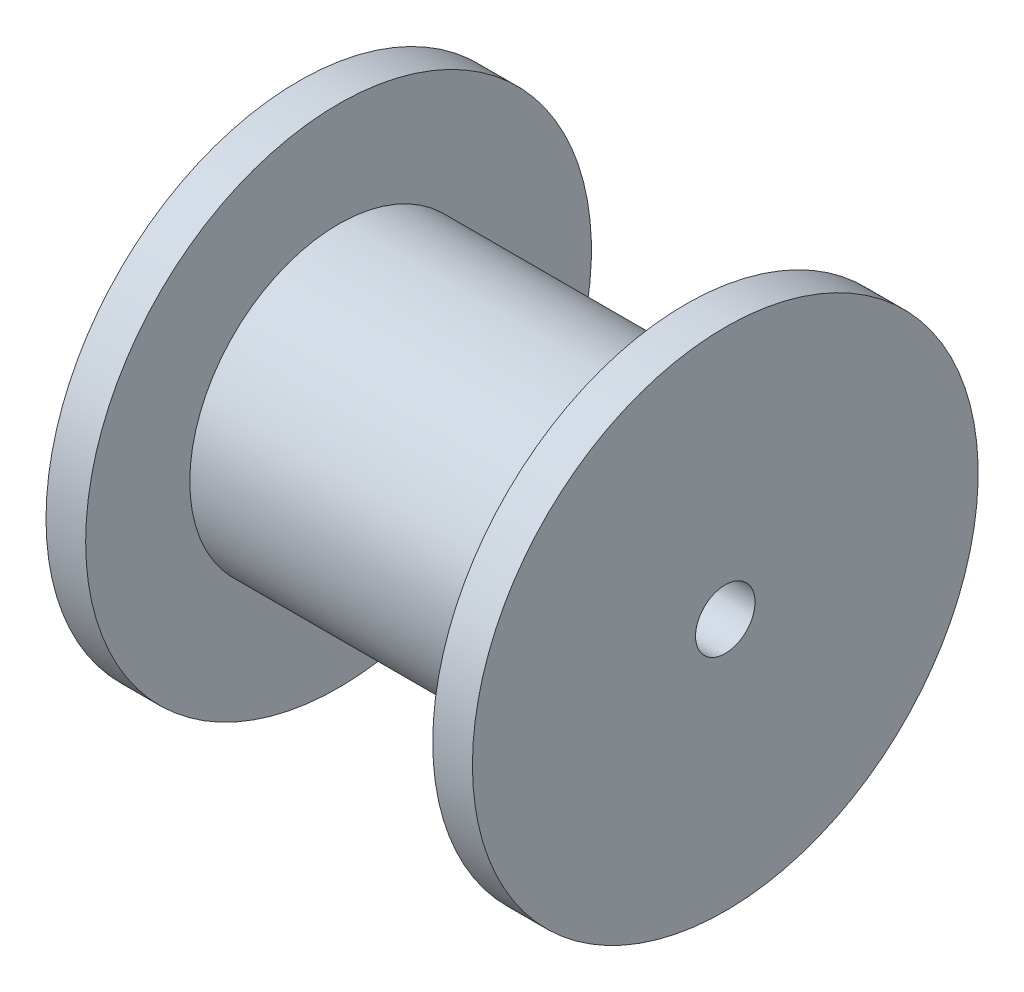
ISO-10303-21;
HEADER;
FILE_DESCRIPTION(('STEP AP214'),'2;1');
FILE_NAME('part.step','',(''),(''),'','','');
FILE_SCHEMA(('AUTOMOTIVE_DESIGN { 1 0 10303 214 1 1 1 1 }'));
ENDSEC;
DATA;
#1=APPLICATION_CONTEXT('core data for automotive mechanical design processes');
#2=APPLICATION_PROTOCOL_DEFINITION('international standard','automotive_design',2000,#1);
#3=PRODUCT_CONTEXT('',#1,'mechanical');
#4=PRODUCT('Part','Part','',(#3));
#5=PRODUCT_RELATED_PRODUCT_CATEGORY('part','',(#4));
#6=PRODUCT_DEFINITION_FORMATION('','',#4);
#7=PRODUCT_DEFINITION_CONTEXT('part definition',#1,'design');
#8=PRODUCT_DEFINITION('design','',#6,#7);
#9=PRODUCT_DEFINITION_SHAPE('','',#8);
#10=(LENGTH_UNIT() NAMED_UNIT(*) SI_UNIT(.MILLI.,.METRE.));
#11=(NAMED_UNIT(*) PLANE_ANGLE_UNIT() SI_UNIT($,.RADIAN.));
#12=(NAMED_UNIT(*) SI_UNIT($,.STERADIAN.) SOLID_ANGLE_UNIT());
#13=UNCERTAINTY_MEASURE_WITH_UNIT(LENGTH_MEASURE(1.E-05),#10,'distance_accuracy_value','');
#14=(GEOMETRIC_REPRESENTATION_CONTEXT(3) GLOBAL_UNCERTAINTY_ASSIGNED_CONTEXT((#13)) GLOBAL_UNIT_ASSIGNED_CONTEXT((#10,
#11,#12)) REPRESENTATION_CONTEXT('',''));
#15=CARTESIAN_POINT('',(0.,0.,0.));
#16=DIRECTION('',(0.,0.,1.));
#17=DIRECTION('',(1.,0.,0.));
#18=AXIS2_PLACEMENT_3D('',#15,#16,#17);
#19=CARTESIAN_POINT('',(0.,3.,0.));
#20=DIRECTION('',(1.,0.,0.));
#21=DIRECTION('',(0.,0.,-1.));
#22=AXIS2_PLACEMENT_3D('',#19,#20,#21);
#23=PLANE('',#22);
#24=CARTESIAN_POINT('',(0.,0.,0.));
#25=DIRECTION('',(-1.,0.,0.));
#26=DIRECTION('',(0.,0.,1.));
#27=AXIS2_PLACEMENT_3D('',#24,#25,#26);
#28=CIRCLE('',#27,3.);
#29=CARTESIAN_POINT('',(0.,0.,3.));
#30=VERTEX_POINT('',#29);
#31=EDGE_CURVE('E80',#30,#30,#28,.T.);
#32=ORIENTED_EDGE('',*,*,#31,.F.);
#33=EDGE_LOOP('',(#32));
#34=FACE_BOUND('',#33,.T.);
#35=CARTESIAN_POINT('',(0.,0.,0.));
#36=DIRECTION('',(-1.,0.,0.));
#37=DIRECTION('',(0.,0.,1.));
#38=AXIS2_PLACEMENT_3D('',#35,#36,#37);
#39=CIRCLE('',#38,25.5);
#40=CARTESIAN_POINT('',(0.,0.,25.5));
#41=VERTEX_POINT('',#40);
#42=EDGE_CURVE('E10',#41,#41,#39,.T.);
#43=ORIENTED_EDGE('',*,*,#42,.T.);
#44=EDGE_LOOP('',(#43));
#45=FACE_BOUND('',#44,.T.);
#46=ADVANCED_FACE('F44',(#34,#45),#23,.F.);
#47=CARTESIAN_POINT('',(0.,0.,0.));
#48=DIRECTION('',(-1.,0.,0.));
#49=DIRECTION('',(0.,0.,1.));
#50=AXIS2_PLACEMENT_3D('',#47,#48,#49);
#51=CYLINDRICAL_SURFACE('',#50,25.5);
#52=ORIENTED_EDGE('',*,*,#42,.F.);
#53=EDGE_LOOP('',(#52));
#54=FACE_BOUND('',#53,.T.);
#55=CARTESIAN_POINT('',(4.,0.,0.));
#56=DIRECTION('',(-1.,0.,0.));
#57=DIRECTION('',(0.,0.,1.));
#58=AXIS2_PLACEMENT_3D('',#55,#56,#57);
#59=CIRCLE('',#58,25.5);
#60=CARTESIAN_POINT('',(4.,0.,25.5));
#61=VERTEX_POINT('',#60);
#62=EDGE_CURVE('E55',#61,#61,#59,.T.);
#63=ORIENTED_EDGE('',*,*,#62,.T.);
#64=EDGE_LOOP('',(#63));
#65=FACE_BOUND('',#64,.T.);
#66=ADVANCED_FACE('F92',(#54,#65),#51,.T.);
#67=CARTESIAN_POINT('',(4.,25.5,0.));
#68=DIRECTION('',(-1.,0.,0.));
#69=DIRECTION('',(0.,0.,1.));
#70=AXIS2_PLACEMENT_3D('',#67,#68,#69);
#71=PLANE('',#70);
#72=ORIENTED_EDGE('',*,*,#62,.F.);
#73=EDGE_LOOP('',(#72));
#74=FACE_BOUND('',#73,.T.);
#75=CARTESIAN_POINT('',(4.,0.,0.));
#76=DIRECTION('',(-1.,0.,0.));
#77=DIRECTION('',(0.,0.,1.));
#78=AXIS2_PLACEMENT_3D('',#75,#76,#77);
#79=CIRCLE('',#78,15.);
#80=CARTESIAN_POINT('',(4.,0.,15.));
#81=VERTEX_POINT('',#80);
#82=EDGE_CURVE('E60',#81,#81,#79,.T.);
#83=ORIENTED_EDGE('',*,*,#82,.T.);
#84=EDGE_LOOP('',(#83));
#85=FACE_BOUND('',#84,.T.);
#86=ADVANCED_FACE('F99',(#74,#85),#71,.F.);
#87=CARTESIAN_POINT('',(0.,0.,0.));
#88=DIRECTION('',(-1.,0.,0.));
#89=DIRECTION('',(0.,0.,1.));
#90=AXIS2_PLACEMENT_3D('',#87,#88,#89);
#91=CYLINDRICAL_SURFACE('',#90,15.);
#92=ORIENTED_EDGE('',*,*,#82,.F.);
#93=EDGE_LOOP('',(#92));
#94=FACE_BOUND('',#93,.T.);
#95=CARTESIAN_POINT('',(39.,0.,0.));
#96=DIRECTION('',(-1.,0.,0.));
#97=DIRECTION('',(0.,0.,1.));
#98=AXIS2_PLACEMENT_3D('',#95,#96,#97);
#99=CIRCLE('',#98,15.);
#100=CARTESIAN_POINT('',(39.,0.,15.));
#101=VERTEX_POINT('',#100);
#102=EDGE_CURVE('E65',#101,#101,#99,.T.);
#103=ORIENTED_EDGE('',*,*,#102,.T.);
#104=EDGE_LOOP('',(#103));
#105=FACE_BOUND('',#104,.T.);
#106=ADVANCED_FACE('F102',(#94,#105),#91,.T.);
#107=CARTESIAN_POINT('',(39.,15.,0.));
#108=DIRECTION('',(1.,0.,0.));
#109=DIRECTION('',(0.,0.,-1.));
#110=AXIS2_PLACEMENT_3D('',#107,#108,#109);
#111=PLANE('',#110);
#112=ORIENTED_EDGE('',*,*,#102,.F.);
#113=EDGE_LOOP('',(#112));
#114=FACE_BOUND('',#113,.T.);
#115=CARTESIAN_POINT('',(39.,0.,0.));
#116=DIRECTION('',(-1.,0.,0.));
#117=DIRECTION('',(0.,0.,1.));
#118=AXIS2_PLACEMENT_3D('',#115,#116,#117);
#119=CIRCLE('',#118,25.5);
#120=CARTESIAN_POINT('',(39.,0.,25.5));
#121=VERTEX_POINT('',#120);
#122=EDGE_CURVE('E66',#121,#121,#119,.T.);
#123=ORIENTED_EDGE('',*,*,#122,.T.);
#124=EDGE_LOOP('',(#123));
#125=FACE_BOUND('',#124,.T.);
#126=ADVANCED_FACE('F111',(#114,#125),#111,.F.);
#127=CARTESIAN_POINT('',(0.,0.,0.));
#128=DIRECTION('',(-1.,0.,0.));
#129=DIRECTION('',(0.,0.,1.));
#130=AXIS2_PLACEMENT_3D('',#127,#128,#129);
#131=CYLINDRICAL_SURFACE('',#130,25.5);
#132=ORIENTED_EDGE('',*,*,#122,.F.);
#133=EDGE_LOOP('',(#132));
#134=FACE_BOUND('',#133,.T.);
#135=CARTESIAN_POINT('',(43.,0.,0.));
#136=DIRECTION('',(-1.,0.,0.));
#137=DIRECTION('',(0.,0.,1.));
#138=AXIS2_PLACEMENT_3D('',#135,#136,#137);
#139=CIRCLE('',#138,25.5);
#140=CARTESIAN_POINT('',(43.,0.,25.5));
#141=VERTEX_POINT('',#140);
#142=EDGE_CURVE('E75',#141,#141,#139,.T.);
#143=ORIENTED_EDGE('',*,*,#142,.T.);
#144=EDGE_LOOP('',(#143));
#145=FACE_BOUND('',#144,.T.);
#146=ADVANCED_FACE('F114',(#134,#145),#131,.T.);
#147=CARTESIAN_POINT('',(43.,3.,0.));
#148=DIRECTION('',(-1.,0.,0.));
#149=DIRECTION('',(0.,0.,1.));
#150=AXIS2_PLACEMENT_3D('',#147,#148,#149);
#151=PLANE('',#150);
#152=CARTESIAN_POINT('',(43.,0.,0.));
#153=DIRECTION('',(-1.,0.,0.));
#154=DIRECTION('',(0.,0.,1.));
#155=AXIS2_PLACEMENT_3D('',#152,#153,#154);
#156=CIRCLE('',#155,3.);
#157=CARTESIAN_POINT('',(43.,0.,3.));
#158=VERTEX_POINT('',#157);
#159=EDGE_CURVE('E77',#158,#158,#156,.T.);
#160=ORIENTED_EDGE('',*,*,#159,.T.);
#161=EDGE_LOOP('',(#160));
#162=FACE_BOUND('',#161,.T.);
#163=ORIENTED_EDGE('',*,*,#142,.F.);
#164=EDGE_LOOP('',(#163));
#165=FACE_BOUND('',#164,.T.);
#166=ADVANCED_FACE('F83',(#162,#165),#151,.F.);
#167=CARTESIAN_POINT('',(43.,0.,0.));
#168=DIRECTION('',(-1.,0.,0.));
#169=DIRECTION('',(0.,0.,1.));
#170=AXIS2_PLACEMENT_3D('',#167,#168,#169);
#171=CYLINDRICAL_SURFACE('',#170,3.);
#172=ORIENTED_EDGE('',*,*,#159,.F.);
#173=EDGE_LOOP('',(#172));
#174=FACE_BOUND('',#173,.T.);
#175=ORIENTED_EDGE('',*,*,#31,.T.);
#176=EDGE_LOOP('',(#175));
#177=FACE_BOUND('',#176,.T.);
#178=ADVANCED_FACE('F86',(#174,#177),#171,.F.);
#179=CLOSED_SHELL('',(#46,#66,#86,#106,#126,#146,#166,#178));
#180=MANIFOLD_SOLID_BREP('B2',#179);
#181=ADVANCED_BREP_SHAPE_REPRESENTATION('',(#18,#180),#14);
#182=SHAPE_DEFINITION_REPRESENTATION(#9,#181);
ENDSEC;
END-ISO-10303-21;
